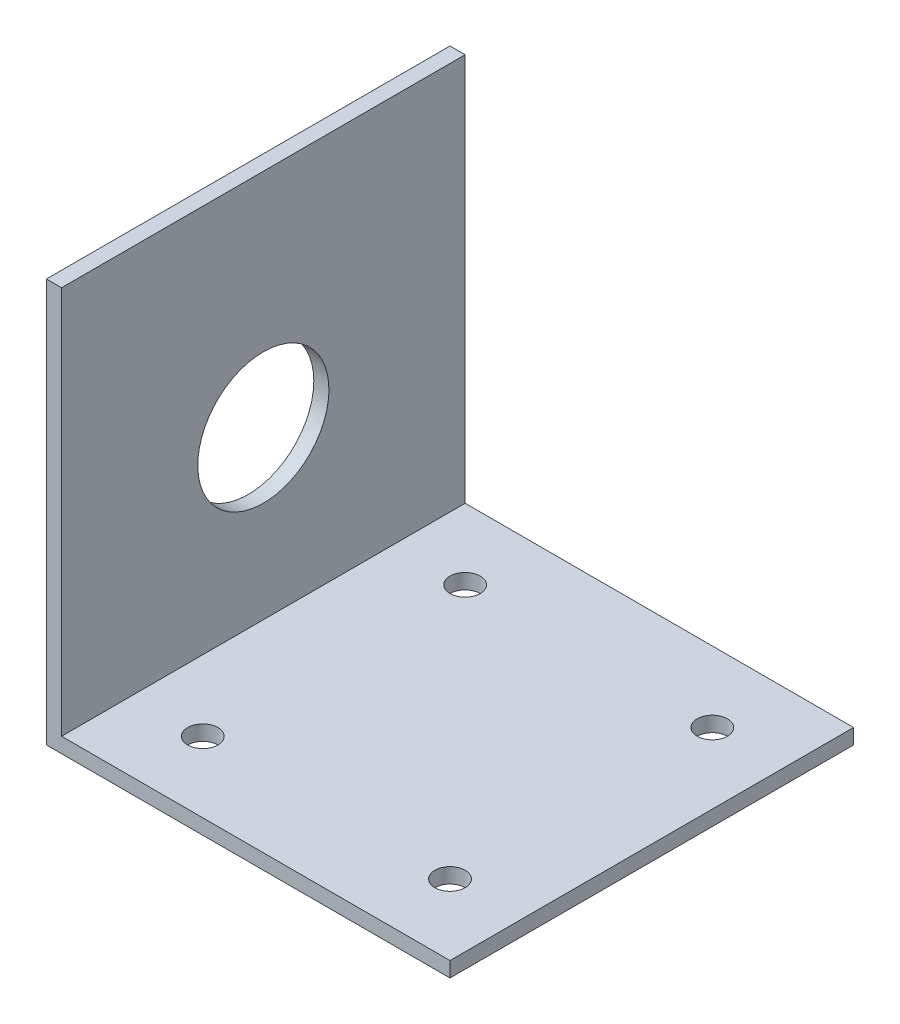
ISO-10303-21;
HEADER;
FILE_DESCRIPTION(('STEP AP214'),'2;1');
FILE_NAME('part.step','',(''),(''),'','','');
FILE_SCHEMA(('AUTOMOTIVE_DESIGN { 1 0 10303 214 1 1 1 1 }'));
ENDSEC;
DATA;
#1=APPLICATION_CONTEXT('core data for automotive mechanical design processes');
#2=APPLICATION_PROTOCOL_DEFINITION('international standard','automotive_design',2000,#1);
#3=PRODUCT_CONTEXT('',#1,'mechanical');
#4=PRODUCT('Part','Part','',(#3));
#5=PRODUCT_RELATED_PRODUCT_CATEGORY('part','',(#4));
#6=PRODUCT_DEFINITION_FORMATION('','',#4);
#7=PRODUCT_DEFINITION_CONTEXT('part definition',#1,'design');
#8=PRODUCT_DEFINITION('design','',#6,#7);
#9=PRODUCT_DEFINITION_SHAPE('','',#8);
#10=(LENGTH_UNIT() NAMED_UNIT(*) SI_UNIT(.MILLI.,.METRE.));
#11=(NAMED_UNIT(*) PLANE_ANGLE_UNIT() SI_UNIT($,.RADIAN.));
#12=(NAMED_UNIT(*) SI_UNIT($,.STERADIAN.) SOLID_ANGLE_UNIT());
#13=UNCERTAINTY_MEASURE_WITH_UNIT(LENGTH_MEASURE(1.E-05),#10,'distance_accuracy_value','');
#14=(GEOMETRIC_REPRESENTATION_CONTEXT(3) GLOBAL_UNCERTAINTY_ASSIGNED_CONTEXT((#13)) GLOBAL_UNIT_ASSIGNED_CONTEXT((#10,
#11,#12)) REPRESENTATION_CONTEXT('',''));
#15=CARTESIAN_POINT('',(0.,0.,0.));
#16=DIRECTION('',(0.,0.,1.));
#17=DIRECTION('',(1.,0.,0.));
#18=AXIS2_PLACEMENT_3D('',#15,#16,#17);
#19=CARTESIAN_POINT('',(40.,0.,40.));
#20=DIRECTION('',(0.,1.,0.));
#21=DIRECTION('',(-1.,0.,0.));
#22=AXIS2_PLACEMENT_3D('',#19,#20,#21);
#23=PLANE('',#22);
#24=CARTESIAN_POINT('',(33.,0.,33.));
#25=DIRECTION('',(0.,1.,0.));
#26=DIRECTION('',(-1.,0.,0.));
#27=AXIS2_PLACEMENT_3D('',#24,#25,#26);
#28=CIRCLE('',#27,1.5);
#29=CARTESIAN_POINT('',(31.5,0.,33.));
#30=VERTEX_POINT('',#29);
#31=EDGE_CURVE('E161',#30,#30,#28,.T.);
#32=ORIENTED_EDGE('',*,*,#31,.T.);
#33=EDGE_LOOP('',(#32));
#34=FACE_BOUND('',#33,.T.);
#35=CARTESIAN_POINT('',(33.,0.,7.));
#36=DIRECTION('',(0.,1.,0.));
#37=DIRECTION('',(-1.,0.,0.));
#38=AXIS2_PLACEMENT_3D('',#35,#36,#37);
#39=CIRCLE('',#38,1.5);
#40=CARTESIAN_POINT('',(31.5,0.,7.));
#41=VERTEX_POINT('',#40);
#42=EDGE_CURVE('E165',#41,#41,#39,.T.);
#43=ORIENTED_EDGE('',*,*,#42,.T.);
#44=EDGE_LOOP('',(#43));
#45=FACE_BOUND('',#44,.T.);
#46=CARTESIAN_POINT('',(8.5,0.,7.));
#47=DIRECTION('',(0.,1.,0.));
#48=DIRECTION('',(-1.,0.,0.));
#49=AXIS2_PLACEMENT_3D('',#46,#47,#48);
#50=CIRCLE('',#49,1.5);
#51=CARTESIAN_POINT('',(7.,0.,7.));
#52=VERTEX_POINT('',#51);
#53=EDGE_CURVE('E169',#52,#52,#50,.T.);
#54=ORIENTED_EDGE('',*,*,#53,.T.);
#55=EDGE_LOOP('',(#54));
#56=FACE_BOUND('',#55,.T.);
#57=CARTESIAN_POINT('',(8.5,0.,33.));
#58=DIRECTION('',(0.,1.,0.));
#59=DIRECTION('',(-1.,0.,0.));
#60=AXIS2_PLACEMENT_3D('',#57,#58,#59);
#61=CIRCLE('',#60,1.5);
#62=CARTESIAN_POINT('',(7.,0.,33.));
#63=VERTEX_POINT('',#62);
#64=EDGE_CURVE('E172',#63,#63,#61,.T.);
#65=ORIENTED_EDGE('',*,*,#64,.T.);
#66=EDGE_LOOP('',(#65));
#67=FACE_BOUND('',#66,.T.);
#68=DIRECTION('',(1.,0.,0.));
#69=VECTOR('',#68,1.);
#70=CARTESIAN_POINT('',(40.,0.,0.));
#71=LINE('',#70,#69);
#72=CARTESIAN_POINT('',(0.,0.,0.));
#73=VERTEX_POINT('',#72);
#74=CARTESIAN_POINT('',(40.,0.,0.));
#75=VERTEX_POINT('',#74);
#76=EDGE_CURVE('E116',#73,#75,#71,.T.);
#77=ORIENTED_EDGE('',*,*,#76,.T.);
#78=DIRECTION('',(0.,0.,-1.));
#79=VECTOR('',#78,1.);
#80=CARTESIAN_POINT('',(40.,0.,40.));
#81=LINE('',#80,#79);
#82=CARTESIAN_POINT('',(40.,0.,40.));
#83=VERTEX_POINT('',#82);
#84=EDGE_CURVE('E11',#83,#75,#81,.T.);
#85=ORIENTED_EDGE('',*,*,#84,.F.);
#86=DIRECTION('',(1.,0.,0.));
#87=VECTOR('',#86,1.);
#88=CARTESIAN_POINT('',(40.,0.,40.));
#89=LINE('',#88,#87);
#90=CARTESIAN_POINT('',(0.,0.,40.));
#91=VERTEX_POINT('',#90);
#92=EDGE_CURVE('E126',#91,#83,#89,.T.);
#93=ORIENTED_EDGE('',*,*,#92,.F.);
#94=DIRECTION('',(0.,0.,-1.));
#95=VECTOR('',#94,1.);
#96=CARTESIAN_POINT('',(0.,0.,40.));
#97=LINE('',#96,#95);
#98=EDGE_CURVE('E112',#91,#73,#97,.T.);
#99=ORIENTED_EDGE('',*,*,#98,.T.);
#100=EDGE_LOOP('',(#77,#85,#93,#99));
#101=FACE_BOUND('',#100,.T.);
#102=ADVANCED_FACE('F31',(#34,#45,#56,#67,#101),#23,.F.);
#103=CARTESIAN_POINT('',(40.,1.5,40.));
#104=DIRECTION('',(-1.,0.,0.));
#105=DIRECTION('',(0.,0.,1.));
#106=AXIS2_PLACEMENT_3D('',#103,#104,#105);
#107=PLANE('',#106);
#108=DIRECTION('',(0.,1.,0.));
#109=VECTOR('',#108,1.);
#110=CARTESIAN_POINT('',(40.,1.5,0.));
#111=LINE('',#110,#109);
#112=CARTESIAN_POINT('',(40.,1.5,0.));
#113=VERTEX_POINT('',#112);
#114=EDGE_CURVE('E119',#75,#113,#111,.T.);
#115=ORIENTED_EDGE('',*,*,#114,.T.);
#116=DIRECTION('',(0.,0.,-1.));
#117=VECTOR('',#116,1.);
#118=CARTESIAN_POINT('',(40.,1.5,40.));
#119=LINE('',#118,#117);
#120=CARTESIAN_POINT('',(40.,1.5,40.));
#121=VERTEX_POINT('',#120);
#122=EDGE_CURVE('E40',#121,#113,#119,.T.);
#123=ORIENTED_EDGE('',*,*,#122,.F.);
#124=DIRECTION('',(0.,1.,0.));
#125=VECTOR('',#124,1.);
#126=CARTESIAN_POINT('',(40.,1.5,40.));
#127=LINE('',#126,#125);
#128=EDGE_CURVE('E85',#83,#121,#127,.T.);
#129=ORIENTED_EDGE('',*,*,#128,.F.);
#130=ORIENTED_EDGE('',*,*,#84,.T.);
#131=EDGE_LOOP('',(#115,#123,#129,#130));
#132=FACE_BOUND('',#131,.T.);
#133=ADVANCED_FACE('F153',(#132),#107,.F.);
#134=CARTESIAN_POINT('',(1.5,1.5,40.));
#135=DIRECTION('',(0.,-1.,0.));
#136=DIRECTION('',(0.,0.,-1.));
#137=AXIS2_PLACEMENT_3D('',#134,#135,#136);
#138=PLANE('',#137);
#139=CARTESIAN_POINT('',(33.,1.5,33.));
#140=DIRECTION('',(0.,1.,0.));
#141=DIRECTION('',(0.,0.,1.));
#142=AXIS2_PLACEMENT_3D('',#139,#140,#141);
#143=CIRCLE('',#142,1.5);
#144=CARTESIAN_POINT('',(33.,1.5,34.5));
#145=VERTEX_POINT('',#144);
#146=EDGE_CURVE('E193',#145,#145,#143,.T.);
#147=ORIENTED_EDGE('',*,*,#146,.F.);
#148=EDGE_LOOP('',(#147));
#149=FACE_BOUND('',#148,.T.);
#150=CARTESIAN_POINT('',(33.,1.5,7.));
#151=DIRECTION('',(0.,1.,0.));
#152=DIRECTION('',(0.,0.,1.));
#153=AXIS2_PLACEMENT_3D('',#150,#151,#152);
#154=CIRCLE('',#153,1.5);
#155=CARTESIAN_POINT('',(33.,1.5,8.5));
#156=VERTEX_POINT('',#155);
#157=EDGE_CURVE('E189',#156,#156,#154,.T.);
#158=ORIENTED_EDGE('',*,*,#157,.F.);
#159=EDGE_LOOP('',(#158));
#160=FACE_BOUND('',#159,.T.);
#161=CARTESIAN_POINT('',(8.5,1.5,7.));
#162=DIRECTION('',(0.,1.,0.));
#163=DIRECTION('',(0.,0.,1.));
#164=AXIS2_PLACEMENT_3D('',#161,#162,#163);
#165=CIRCLE('',#164,1.5);
#166=CARTESIAN_POINT('',(8.5,1.5,8.5));
#167=VERTEX_POINT('',#166);
#168=EDGE_CURVE('E185',#167,#167,#165,.T.);
#169=ORIENTED_EDGE('',*,*,#168,.F.);
#170=EDGE_LOOP('',(#169));
#171=FACE_BOUND('',#170,.T.);
#172=CARTESIAN_POINT('',(8.5,1.5,33.));
#173=DIRECTION('',(0.,1.,0.));
#174=DIRECTION('',(0.,0.,1.));
#175=AXIS2_PLACEMENT_3D('',#172,#173,#174);
#176=CIRCLE('',#175,1.5);
#177=CARTESIAN_POINT('',(8.5,1.5,34.5));
#178=VERTEX_POINT('',#177);
#179=EDGE_CURVE('E175',#178,#178,#176,.T.);
#180=ORIENTED_EDGE('',*,*,#179,.F.);
#181=EDGE_LOOP('',(#180));
#182=FACE_BOUND('',#181,.T.);
#183=DIRECTION('',(-1.,0.,0.));
#184=VECTOR('',#183,1.);
#185=CARTESIAN_POINT('',(1.5,1.5,0.));
#186=LINE('',#185,#184);
#187=CARTESIAN_POINT('',(1.5,1.5,0.));
#188=VERTEX_POINT('',#187);
#189=EDGE_CURVE('E121',#113,#188,#186,.T.);
#190=ORIENTED_EDGE('',*,*,#189,.T.);
#191=DIRECTION('',(0.,0.,-1.));
#192=VECTOR('',#191,1.);
#193=CARTESIAN_POINT('',(1.5,1.5,40.));
#194=LINE('',#193,#192);
#195=CARTESIAN_POINT('',(1.5,1.5,40.));
#196=VERTEX_POINT('',#195);
#197=EDGE_CURVE('E107',#196,#188,#194,.T.);
#198=ORIENTED_EDGE('',*,*,#197,.F.);
#199=DIRECTION('',(-1.,0.,0.));
#200=VECTOR('',#199,1.);
#201=CARTESIAN_POINT('',(1.5,1.5,40.));
#202=LINE('',#201,#200);
#203=EDGE_CURVE('E98',#121,#196,#202,.T.);
#204=ORIENTED_EDGE('',*,*,#203,.F.);
#205=ORIENTED_EDGE('',*,*,#122,.T.);
#206=EDGE_LOOP('',(#190,#198,#204,#205));
#207=FACE_BOUND('',#206,.T.);
#208=ADVANCED_FACE('F133',(#149,#160,#171,#182,#207),#138,.F.);
#209=CARTESIAN_POINT('',(1.5,40.,40.));
#210=DIRECTION('',(-1.,0.,0.));
#211=DIRECTION('',(0.,-1.,0.));
#212=AXIS2_PLACEMENT_3D('',#209,#210,#211);
#213=PLANE('',#212);
#214=CARTESIAN_POINT('',(1.5,18.,20.));
#215=DIRECTION('',(1.,0.,0.));
#216=DIRECTION('',(0.,1.,0.));
#217=AXIS2_PLACEMENT_3D('',#214,#215,#216);
#218=CIRCLE('',#217,6.5);
#219=CARTESIAN_POINT('',(1.5,24.5,20.));
#220=VERTEX_POINT('',#219);
#221=EDGE_CURVE('E174',#220,#220,#218,.T.);
#222=ORIENTED_EDGE('',*,*,#221,.F.);
#223=EDGE_LOOP('',(#222));
#224=FACE_BOUND('',#223,.T.);
#225=DIRECTION('',(0.,1.,0.));
#226=VECTOR('',#225,1.);
#227=CARTESIAN_POINT('',(1.5,40.,0.));
#228=LINE('',#227,#226);
#229=CARTESIAN_POINT('',(1.5,40.,0.));
#230=VERTEX_POINT('',#229);
#231=EDGE_CURVE('E106',#188,#230,#228,.T.);
#232=ORIENTED_EDGE('',*,*,#231,.T.);
#233=DIRECTION('',(0.,0.,-1.));
#234=VECTOR('',#233,1.);
#235=CARTESIAN_POINT('',(1.5,40.,40.));
#236=LINE('',#235,#234);
#237=CARTESIAN_POINT('',(1.5,40.,40.));
#238=VERTEX_POINT('',#237);
#239=EDGE_CURVE('E103',#238,#230,#236,.T.);
#240=ORIENTED_EDGE('',*,*,#239,.F.);
#241=DIRECTION('',(0.,1.,0.));
#242=VECTOR('',#241,1.);
#243=CARTESIAN_POINT('',(1.5,40.,40.));
#244=LINE('',#243,#242);
#245=EDGE_CURVE('E92',#196,#238,#244,.T.);
#246=ORIENTED_EDGE('',*,*,#245,.F.);
#247=ORIENTED_EDGE('',*,*,#197,.T.);
#248=EDGE_LOOP('',(#232,#240,#246,#247));
#249=FACE_BOUND('',#248,.T.);
#250=ADVANCED_FACE('F104',(#224,#249),#213,.F.);
#251=CARTESIAN_POINT('',(0.,40.,40.));
#252=DIRECTION('',(0.,-1.,0.));
#253=DIRECTION('',(0.,0.,-1.));
#254=AXIS2_PLACEMENT_3D('',#251,#252,#253);
#255=PLANE('',#254);
#256=DIRECTION('',(-1.,0.,0.));
#257=VECTOR('',#256,1.);
#258=CARTESIAN_POINT('',(0.,40.,0.));
#259=LINE('',#258,#257);
#260=CARTESIAN_POINT('',(0.,40.,0.));
#261=VERTEX_POINT('',#260);
#262=EDGE_CURVE('E71',#230,#261,#259,.T.);
#263=ORIENTED_EDGE('',*,*,#262,.T.);
#264=DIRECTION('',(0.,0.,-1.));
#265=VECTOR('',#264,1.);
#266=CARTESIAN_POINT('',(0.,40.,40.));
#267=LINE('',#266,#265);
#268=CARTESIAN_POINT('',(0.,40.,40.));
#269=VERTEX_POINT('',#268);
#270=EDGE_CURVE('E108',#269,#261,#267,.T.);
#271=ORIENTED_EDGE('',*,*,#270,.F.);
#272=DIRECTION('',(-1.,0.,0.));
#273=VECTOR('',#272,1.);
#274=CARTESIAN_POINT('',(0.,40.,40.));
#275=LINE('',#274,#273);
#276=EDGE_CURVE('E96',#238,#269,#275,.T.);
#277=ORIENTED_EDGE('',*,*,#276,.F.);
#278=ORIENTED_EDGE('',*,*,#239,.T.);
#279=EDGE_LOOP('',(#263,#271,#277,#278));
#280=FACE_BOUND('',#279,.T.);
#281=ADVANCED_FACE('F110',(#280),#255,.F.);
#282=CARTESIAN_POINT('',(0.,0.,40.));
#283=DIRECTION('',(1.,0.,0.));
#284=DIRECTION('',(0.,0.,-1.));
#285=AXIS2_PLACEMENT_3D('',#282,#283,#284);
#286=PLANE('',#285);
#287=CARTESIAN_POINT('',(0.,18.,20.));
#288=DIRECTION('',(1.,0.,0.));
#289=DIRECTION('',(0.,0.,-1.));
#290=AXIS2_PLACEMENT_3D('',#287,#288,#289);
#291=CIRCLE('',#290,6.5);
#292=CARTESIAN_POINT('',(0.,18.,13.5));
#293=VERTEX_POINT('',#292);
#294=EDGE_CURVE('E34',#293,#293,#291,.T.);
#295=ORIENTED_EDGE('',*,*,#294,.T.);
#296=EDGE_LOOP('',(#295));
#297=FACE_BOUND('',#296,.T.);
#298=DIRECTION('',(0.,-1.,0.));
#299=VECTOR('',#298,1.);
#300=CARTESIAN_POINT('',(0.,0.,0.));
#301=LINE('',#300,#299);
#302=EDGE_CURVE('E77',#261,#73,#301,.T.);
#303=ORIENTED_EDGE('',*,*,#302,.T.);
#304=ORIENTED_EDGE('',*,*,#98,.F.);
#305=DIRECTION('',(0.,-1.,0.));
#306=VECTOR('',#305,1.);
#307=CARTESIAN_POINT('',(0.,0.,40.));
#308=LINE('',#307,#306);
#309=EDGE_CURVE('E48',#269,#91,#308,.T.);
#310=ORIENTED_EDGE('',*,*,#309,.F.);
#311=ORIENTED_EDGE('',*,*,#270,.T.);
#312=EDGE_LOOP('',(#303,#304,#310,#311));
#313=FACE_BOUND('',#312,.T.);
#314=ADVANCED_FACE('F140',(#297,#313),#286,.F.);
#315=CARTESIAN_POINT('',(0.,0.,40.));
#316=DIRECTION('',(0.,0.,-1.));
#317=DIRECTION('',(-1.,0.,0.));
#318=AXIS2_PLACEMENT_3D('',#315,#316,#317);
#319=PLANE('',#318);
#320=ORIENTED_EDGE('',*,*,#92,.T.);
#321=ORIENTED_EDGE('',*,*,#128,.T.);
#322=ORIENTED_EDGE('',*,*,#203,.T.);
#323=ORIENTED_EDGE('',*,*,#245,.T.);
#324=ORIENTED_EDGE('',*,*,#276,.T.);
#325=ORIENTED_EDGE('',*,*,#309,.T.);
#326=EDGE_LOOP('',(#320,#321,#322,#323,#324,#325));
#327=FACE_BOUND('',#326,.T.);
#328=ADVANCED_FACE('F94',(#327),#319,.F.);
#329=CARTESIAN_POINT('',(0.,0.,0.));
#330=DIRECTION('',(0.,0.,-1.));
#331=DIRECTION('',(-1.,0.,0.));
#332=AXIS2_PLACEMENT_3D('',#329,#330,#331);
#333=PLANE('',#332);
#334=ORIENTED_EDGE('',*,*,#76,.F.);
#335=ORIENTED_EDGE('',*,*,#302,.F.);
#336=ORIENTED_EDGE('',*,*,#262,.F.);
#337=ORIENTED_EDGE('',*,*,#231,.F.);
#338=ORIENTED_EDGE('',*,*,#189,.F.);
#339=ORIENTED_EDGE('',*,*,#114,.F.);
#340=EDGE_LOOP('',(#334,#335,#336,#337,#338,#339));
#341=FACE_BOUND('',#340,.T.);
#342=ADVANCED_FACE('F136',(#341),#333,.T.);
#343=CARTESIAN_POINT('',(-28.5,18.,20.));
#344=DIRECTION('',(1.,0.,0.));
#345=DIRECTION('',(0.,1.,0.));
#346=AXIS2_PLACEMENT_3D('',#343,#344,#345);
#347=CYLINDRICAL_SURFACE('',#346,6.5);
#348=ORIENTED_EDGE('',*,*,#221,.T.);
#349=EDGE_LOOP('',(#348));
#350=FACE_BOUND('',#349,.T.);
#351=ORIENTED_EDGE('',*,*,#294,.F.);
#352=EDGE_LOOP('',(#351));
#353=FACE_BOUND('',#352,.T.);
#354=ADVANCED_FACE('F212',(#350,#353),#347,.F.);
#355=CARTESIAN_POINT('',(8.5,-28.5,33.));
#356=DIRECTION('',(0.,1.,0.));
#357=DIRECTION('',(0.,0.,1.));
#358=AXIS2_PLACEMENT_3D('',#355,#356,#357);
#359=CYLINDRICAL_SURFACE('',#358,1.5);
#360=ORIENTED_EDGE('',*,*,#179,.T.);
#361=EDGE_LOOP('',(#360));
#362=FACE_BOUND('',#361,.T.);
#363=ORIENTED_EDGE('',*,*,#64,.F.);
#364=EDGE_LOOP('',(#363));
#365=FACE_BOUND('',#364,.T.);
#366=ADVANCED_FACE('F209',(#362,#365),#359,.F.);
#367=CARTESIAN_POINT('',(8.5,-28.5,7.));
#368=DIRECTION('',(0.,1.,0.));
#369=DIRECTION('',(0.,0.,1.));
#370=AXIS2_PLACEMENT_3D('',#367,#368,#369);
#371=CYLINDRICAL_SURFACE('',#370,1.5);
#372=ORIENTED_EDGE('',*,*,#168,.T.);
#373=EDGE_LOOP('',(#372));
#374=FACE_BOUND('',#373,.T.);
#375=ORIENTED_EDGE('',*,*,#53,.F.);
#376=EDGE_LOOP('',(#375));
#377=FACE_BOUND('',#376,.T.);
#378=ADVANCED_FACE('F211',(#374,#377),#371,.F.);
#379=CARTESIAN_POINT('',(33.,-28.5,7.));
#380=DIRECTION('',(0.,1.,0.));
#381=DIRECTION('',(0.,0.,1.));
#382=AXIS2_PLACEMENT_3D('',#379,#380,#381);
#383=CYLINDRICAL_SURFACE('',#382,1.5);
#384=ORIENTED_EDGE('',*,*,#157,.T.);
#385=EDGE_LOOP('',(#384));
#386=FACE_BOUND('',#385,.T.);
#387=ORIENTED_EDGE('',*,*,#42,.F.);
#388=EDGE_LOOP('',(#387));
#389=FACE_BOUND('',#388,.T.);
#390=ADVANCED_FACE('F218',(#386,#389),#383,.F.);
#391=CARTESIAN_POINT('',(33.,-28.5,33.));
#392=DIRECTION('',(0.,1.,0.));
#393=DIRECTION('',(0.,0.,1.));
#394=AXIS2_PLACEMENT_3D('',#391,#392,#393);
#395=CYLINDRICAL_SURFACE('',#394,1.5);
#396=ORIENTED_EDGE('',*,*,#146,.T.);
#397=EDGE_LOOP('',(#396));
#398=FACE_BOUND('',#397,.T.);
#399=ORIENTED_EDGE('',*,*,#31,.F.);
#400=EDGE_LOOP('',(#399));
#401=FACE_BOUND('',#400,.T.);
#402=ADVANCED_FACE('F197',(#398,#401),#395,.F.);
#403=CLOSED_SHELL('',(#102,#133,#208,#250,#281,#314,#328,#342,#354,#366,#378,#390,#402));
#404=MANIFOLD_SOLID_BREP('B2',#403);
#405=ADVANCED_BREP_SHAPE_REPRESENTATION('',(#18,#404),#14);
#406=SHAPE_DEFINITION_REPRESENTATION(#9,#405);
ENDSEC;
END-ISO-10303-21;
